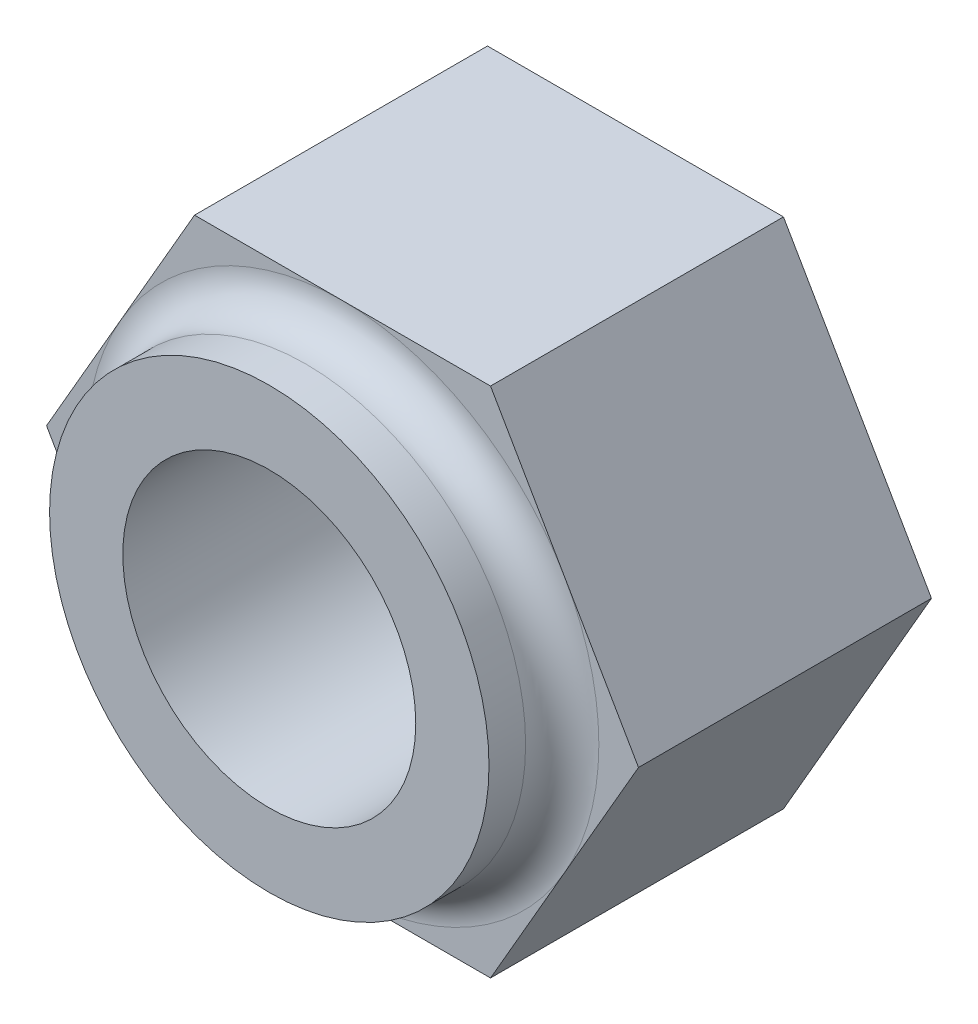
ISO-10303-21;
HEADER;
FILE_DESCRIPTION(('STEP AP214'),'2;1');
FILE_NAME('part.step','',(''),(''),'','','');
FILE_SCHEMA(('AUTOMOTIVE_DESIGN { 1 0 10303 214 1 1 1 1 }'));
ENDSEC;
DATA;
#1=APPLICATION_CONTEXT('core data for automotive mechanical design processes');
#2=APPLICATION_PROTOCOL_DEFINITION('international standard','automotive_design',2000,#1);
#3=PRODUCT_CONTEXT('',#1,'mechanical');
#4=PRODUCT('Part','Part','',(#3));
#5=PRODUCT_RELATED_PRODUCT_CATEGORY('part','',(#4));
#6=PRODUCT_DEFINITION_FORMATION('','',#4);
#7=PRODUCT_DEFINITION_CONTEXT('part definition',#1,'design');
#8=PRODUCT_DEFINITION('design','',#6,#7);
#9=PRODUCT_DEFINITION_SHAPE('','',#8);
#10=(LENGTH_UNIT() NAMED_UNIT(*) SI_UNIT(.MILLI.,.METRE.));
#11=(NAMED_UNIT(*) PLANE_ANGLE_UNIT() SI_UNIT($,.RADIAN.));
#12=(NAMED_UNIT(*) SI_UNIT($,.STERADIAN.) SOLID_ANGLE_UNIT());
#13=UNCERTAINTY_MEASURE_WITH_UNIT(LENGTH_MEASURE(1.E-05),#10,'distance_accuracy_value','');
#14=(GEOMETRIC_REPRESENTATION_CONTEXT(3) GLOBAL_UNCERTAINTY_ASSIGNED_CONTEXT((#13)) GLOBAL_UNIT_ASSIGNED_CONTEXT((#10,
#11,#12)) REPRESENTATION_CONTEXT('',''));
#15=CARTESIAN_POINT('',(0.,0.,0.));
#16=DIRECTION('',(0.,0.,1.));
#17=DIRECTION('',(1.,0.,0.));
#18=AXIS2_PLACEMENT_3D('',#15,#16,#17);
#19=CARTESIAN_POINT('',(0.,0.,4.));
#20=DIRECTION('',(0.,0.,1.));
#21=DIRECTION('',(1.,0.,0.));
#22=AXIS2_PLACEMENT_3D('',#19,#20,#21);
#23=PLANE('',#22);
#24=DIRECTION('',(0.499999999999995,0.866025403784441,0.));
#25=VECTOR('',#24,1.);
#26=CARTESIAN_POINT('',(2.02072594216373,-3.49999999999998,4.));
#27=LINE('',#26,#25);
#28=CARTESIAN_POINT('',(2.02072594216373,-3.49999999999998,4.));
#29=VERTEX_POINT('',#28);
#30=CARTESIAN_POINT('',(3.03108891324556,-1.74999999999999,4.));
#31=VERTEX_POINT('',#30);
#32=EDGE_CURVE('E122',#29,#31,#27,.T.);
#33=ORIENTED_EDGE('',*,*,#32,.T.);
#34=CARTESIAN_POINT('',(0.,0.,4.));
#35=DIRECTION('',(0.,0.,1.));
#36=DIRECTION('',(1.,0.,0.));
#37=AXIS2_PLACEMENT_3D('',#34,#35,#36);
#38=CIRCLE('',#37,3.5);
#39=CARTESIAN_POINT('',(0.,-3.5,4.));
#40=VERTEX_POINT('',#39);
#41=EDGE_CURVE('E11',#31,#40,#38,.F.);
#42=ORIENTED_EDGE('',*,*,#41,.T.);
#43=DIRECTION('',(1.,0.,0.));
#44=VECTOR('',#43,1.);
#45=CARTESIAN_POINT('',(-2.02072594216366,-3.50000000000002,4.));
#46=LINE('',#45,#44);
#47=EDGE_CURVE('E187',#40,#29,#46,.T.);
#48=ORIENTED_EDGE('',*,*,#47,.T.);
#49=EDGE_LOOP('',(#33,#42,#48));
#50=FACE_BOUND('',#49,.T.);
#51=ADVANCED_FACE('F43',(#50),#23,.T.);
#52=CARTESIAN_POINT('',(-2.02072594216366,-3.50000000000002,4.));
#53=VERTEX_POINT('',#52);
#54=EDGE_CURVE('E188',#53,#40,#46,.T.);
#55=ORIENTED_EDGE('',*,*,#54,.T.);
#56=CARTESIAN_POINT('',(0.,0.,4.));
#57=DIRECTION('',(0.,0.,1.));
#58=DIRECTION('',(1.,0.,0.));
#59=AXIS2_PLACEMENT_3D('',#56,#57,#58);
#60=CIRCLE('',#59,3.5);
#61=CARTESIAN_POINT('',(-3.03108891324552,-1.75000000000002,4.));
#62=VERTEX_POINT('',#61);
#63=EDGE_CURVE('E51',#40,#62,#60,.F.);
#64=ORIENTED_EDGE('',*,*,#63,.T.);
#65=DIRECTION('',(0.500000000000007,-0.866025403784434,0.));
#66=VECTOR('',#65,1.);
#67=CARTESIAN_POINT('',(-4.04145188432738,0.,4.));
#68=LINE('',#67,#66);
#69=EDGE_CURVE('E176',#62,#53,#68,.T.);
#70=ORIENTED_EDGE('',*,*,#69,.T.);
#71=EDGE_LOOP('',(#55,#64,#70));
#72=FACE_BOUND('',#71,.T.);
#73=ADVANCED_FACE('F226',(#72),#23,.T.);
#74=CARTESIAN_POINT('',(-4.04145188432738,0.,4.));
#75=VERTEX_POINT('',#74);
#76=EDGE_CURVE('E160',#75,#62,#68,.T.);
#77=ORIENTED_EDGE('',*,*,#76,.T.);
#78=CARTESIAN_POINT('',(0.,0.,4.));
#79=DIRECTION('',(0.,0.,1.));
#80=DIRECTION('',(1.,0.,0.));
#81=AXIS2_PLACEMENT_3D('',#78,#79,#80);
#82=CIRCLE('',#81,3.5);
#83=CARTESIAN_POINT('',(-3.03108891324554,1.74999999999998,4.));
#84=VERTEX_POINT('',#83);
#85=EDGE_CURVE('E153',#62,#84,#82,.F.);
#86=ORIENTED_EDGE('',*,*,#85,.T.);
#87=DIRECTION('',(-0.499999999999995,-0.866025403784441,0.));
#88=VECTOR('',#87,1.);
#89=CARTESIAN_POINT('',(-2.02072594216371,3.49999999999999,4.));
#90=LINE('',#89,#88);
#91=EDGE_CURVE('E158',#84,#75,#90,.T.);
#92=ORIENTED_EDGE('',*,*,#91,.T.);
#93=EDGE_LOOP('',(#77,#86,#92));
#94=FACE_BOUND('',#93,.T.);
#95=ADVANCED_FACE('F157',(#94),#23,.T.);
#96=CARTESIAN_POINT('',(-2.02072594216371,3.49999999999999,4.));
#97=VERTEX_POINT('',#96);
#98=EDGE_CURVE('E167',#97,#84,#90,.T.);
#99=ORIENTED_EDGE('',*,*,#98,.T.);
#100=CARTESIAN_POINT('',(0.,0.,4.));
#101=DIRECTION('',(0.,0.,1.));
#102=DIRECTION('',(1.,0.,0.));
#103=AXIS2_PLACEMENT_3D('',#100,#101,#102);
#104=CIRCLE('',#103,3.5);
#105=CARTESIAN_POINT('',(0.,3.5,4.));
#106=VERTEX_POINT('',#105);
#107=EDGE_CURVE('E151',#84,#106,#104,.F.);
#108=ORIENTED_EDGE('',*,*,#107,.T.);
#109=DIRECTION('',(-1.,0.,0.));
#110=VECTOR('',#109,1.);
#111=CARTESIAN_POINT('',(2.02072594216368,3.50000000000001,4.));
#112=LINE('',#111,#110);
#113=EDGE_CURVE('E133',#106,#97,#112,.T.);
#114=ORIENTED_EDGE('',*,*,#113,.T.);
#115=EDGE_LOOP('',(#99,#108,#114));
#116=FACE_BOUND('',#115,.T.);
#117=ADVANCED_FACE('F174',(#116),#23,.T.);
#118=CARTESIAN_POINT('',(2.02072594216368,3.50000000000001,4.));
#119=VERTEX_POINT('',#118);
#120=EDGE_CURVE('E171',#119,#106,#112,.T.);
#121=ORIENTED_EDGE('',*,*,#120,.T.);
#122=CARTESIAN_POINT('',(0.,0.,4.));
#123=DIRECTION('',(0.,0.,1.));
#124=DIRECTION('',(1.,0.,0.));
#125=AXIS2_PLACEMENT_3D('',#122,#123,#124);
#126=CIRCLE('',#125,3.5);
#127=CARTESIAN_POINT('',(3.03108891324553,1.75,4.));
#128=VERTEX_POINT('',#127);
#129=EDGE_CURVE('E149',#106,#128,#126,.F.);
#130=ORIENTED_EDGE('',*,*,#129,.T.);
#131=DIRECTION('',(-0.500000000000001,0.866025403784438,0.));
#132=VECTOR('',#131,1.);
#133=CARTESIAN_POINT('',(4.04145188432738,0.,4.));
#134=LINE('',#133,#132);
#135=EDGE_CURVE('E132',#128,#119,#134,.T.);
#136=ORIENTED_EDGE('',*,*,#135,.T.);
#137=EDGE_LOOP('',(#121,#130,#136));
#138=FACE_BOUND('',#137,.T.);
#139=ADVANCED_FACE('F181',(#138),#23,.T.);
#140=CARTESIAN_POINT('',(0.,0.,5.));
#141=DIRECTION('',(0.,0.,1.));
#142=DIRECTION('',(1.,0.,0.));
#143=AXIS2_PLACEMENT_3D('',#140,#141,#142);
#144=PLANE('',#143);
#145=CARTESIAN_POINT('',(0.,0.,5.));
#146=DIRECTION('',(0.,0.,1.));
#147=DIRECTION('',(1.,0.,0.));
#148=AXIS2_PLACEMENT_3D('',#145,#146,#147);
#149=CIRCLE('',#148,2.);
#150=CARTESIAN_POINT('',(2.,0.,5.));
#151=VERTEX_POINT('',#150);
#152=EDGE_CURVE('E191',#151,#151,#149,.T.);
#153=ORIENTED_EDGE('',*,*,#152,.F.);
#154=EDGE_LOOP('',(#153));
#155=FACE_BOUND('',#154,.T.);
#156=CARTESIAN_POINT('',(0.,0.,5.));
#157=DIRECTION('',(0.,0.,1.));
#158=DIRECTION('',(1.,0.,0.));
#159=AXIS2_PLACEMENT_3D('',#156,#157,#158);
#160=CIRCLE('',#159,3.);
#161=CARTESIAN_POINT('',(3.,0.,5.));
#162=VERTEX_POINT('',#161);
#163=EDGE_CURVE('E123',#162,#162,#160,.T.);
#164=ORIENTED_EDGE('',*,*,#163,.T.);
#165=EDGE_LOOP('',(#164));
#166=FACE_BOUND('',#165,.T.);
#167=ADVANCED_FACE('F236',(#155,#166),#144,.T.);
#168=CARTESIAN_POINT('',(2.02072594216373,-3.49999999999998,5.));
#169=DIRECTION('',(-0.866025403784441,0.499999999999995,0.));
#170=DIRECTION('',(-0.499999999999995,-0.866025403784441,0.));
#171=AXIS2_PLACEMENT_3D('',#168,#169,#170);
#172=PLANE('',#171);
#173=ORIENTED_EDGE('',*,*,#32,.F.);
#174=DIRECTION('',(0.,0.,-1.));
#175=VECTOR('',#174,1.);
#176=CARTESIAN_POINT('',(2.02072594216373,-3.49999999999998,5.));
#177=LINE('',#176,#175);
#178=CARTESIAN_POINT('',(2.02072594216373,-3.49999999999998,0.));
#179=VERTEX_POINT('',#178);
#180=EDGE_CURVE('E210',#29,#179,#177,.T.);
#181=ORIENTED_EDGE('',*,*,#180,.T.);
#182=DIRECTION('',(0.499999999999995,0.866025403784441,0.));
#183=VECTOR('',#182,1.);
#184=CARTESIAN_POINT('',(2.02072594216373,-3.49999999999998,0.));
#185=LINE('',#184,#183);
#186=CARTESIAN_POINT('',(4.04145188432738,0.,0.));
#187=VERTEX_POINT('',#186);
#188=EDGE_CURVE('E138',#179,#187,#185,.T.);
#189=ORIENTED_EDGE('',*,*,#188,.T.);
#190=DIRECTION('',(0.,0.,-1.));
#191=VECTOR('',#190,1.);
#192=CARTESIAN_POINT('',(4.04145188432738,0.,5.));
#193=LINE('',#192,#191);
#194=CARTESIAN_POINT('',(4.04145188432738,0.,4.));
#195=VERTEX_POINT('',#194);
#196=EDGE_CURVE('E129',#195,#187,#193,.T.);
#197=ORIENTED_EDGE('',*,*,#196,.F.);
#198=EDGE_CURVE('E112',#31,#195,#27,.T.);
#199=ORIENTED_EDGE('',*,*,#198,.F.);
#200=EDGE_LOOP('',(#173,#181,#189,#197,#199));
#201=FACE_BOUND('',#200,.T.);
#202=ADVANCED_FACE('F136',(#201),#172,.F.);
#203=CARTESIAN_POINT('',(4.04145188432738,0.,5.));
#204=DIRECTION('',(-0.866025403784438,-0.500000000000001,0.));
#205=DIRECTION('',(0.500000000000001,-0.866025403784438,0.));
#206=AXIS2_PLACEMENT_3D('',#203,#204,#205);
#207=PLANE('',#206);
#208=EDGE_CURVE('E115',#195,#128,#134,.T.);
#209=ORIENTED_EDGE('',*,*,#208,.F.);
#210=ORIENTED_EDGE('',*,*,#196,.T.);
#211=DIRECTION('',(-0.500000000000001,0.866025403784438,0.));
#212=VECTOR('',#211,1.);
#213=CARTESIAN_POINT('',(4.04145188432738,0.,0.));
#214=LINE('',#213,#212);
#215=CARTESIAN_POINT('',(2.02072594216368,3.50000000000001,0.));
#216=VERTEX_POINT('',#215);
#217=EDGE_CURVE('E197',#187,#216,#214,.T.);
#218=ORIENTED_EDGE('',*,*,#217,.T.);
#219=DIRECTION('',(0.,0.,-1.));
#220=VECTOR('',#219,1.);
#221=CARTESIAN_POINT('',(2.02072594216368,3.50000000000001,5.));
#222=LINE('',#221,#220);
#223=EDGE_CURVE('E140',#119,#216,#222,.T.);
#224=ORIENTED_EDGE('',*,*,#223,.F.);
#225=ORIENTED_EDGE('',*,*,#135,.F.);
#226=EDGE_LOOP('',(#209,#210,#218,#224,#225));
#227=FACE_BOUND('',#226,.T.);
#228=ADVANCED_FACE('F127',(#227),#207,.F.);
#229=CARTESIAN_POINT('',(2.02072594216368,3.50000000000001,5.));
#230=DIRECTION('',(0.,-1.,0.));
#231=DIRECTION('',(1.,0.,0.));
#232=AXIS2_PLACEMENT_3D('',#229,#230,#231);
#233=PLANE('',#232);
#234=ORIENTED_EDGE('',*,*,#120,.F.);
#235=ORIENTED_EDGE('',*,*,#223,.T.);
#236=DIRECTION('',(-1.,0.,0.));
#237=VECTOR('',#236,1.);
#238=CARTESIAN_POINT('',(2.02072594216368,3.50000000000001,0.));
#239=LINE('',#238,#237);
#240=CARTESIAN_POINT('',(-2.02072594216371,3.49999999999999,0.));
#241=VERTEX_POINT('',#240);
#242=EDGE_CURVE('E199',#216,#241,#239,.T.);
#243=ORIENTED_EDGE('',*,*,#242,.T.);
#244=DIRECTION('',(0.,0.,-1.));
#245=VECTOR('',#244,1.);
#246=CARTESIAN_POINT('',(-2.02072594216371,3.49999999999999,5.));
#247=LINE('',#246,#245);
#248=EDGE_CURVE('E144',#97,#241,#247,.T.);
#249=ORIENTED_EDGE('',*,*,#248,.F.);
#250=ORIENTED_EDGE('',*,*,#113,.F.);
#251=EDGE_LOOP('',(#234,#235,#243,#249,#250));
#252=FACE_BOUND('',#251,.T.);
#253=ADVANCED_FACE('F217',(#252),#233,.F.);
#254=CARTESIAN_POINT('',(-2.02072594216371,3.49999999999999,5.));
#255=DIRECTION('',(0.866025403784442,-0.499999999999995,0.));
#256=DIRECTION('',(0.499999999999995,0.866025403784442,0.));
#257=AXIS2_PLACEMENT_3D('',#254,#255,#256);
#258=PLANE('',#257);
#259=ORIENTED_EDGE('',*,*,#98,.F.);
#260=ORIENTED_EDGE('',*,*,#248,.T.);
#261=DIRECTION('',(-0.499999999999995,-0.866025403784441,0.));
#262=VECTOR('',#261,1.);
#263=CARTESIAN_POINT('',(-2.02072594216371,3.49999999999999,0.));
#264=LINE('',#263,#262);
#265=CARTESIAN_POINT('',(-4.04145188432738,0.,0.));
#266=VERTEX_POINT('',#265);
#267=EDGE_CURVE('E202',#241,#266,#264,.T.);
#268=ORIENTED_EDGE('',*,*,#267,.T.);
#269=DIRECTION('',(0.,0.,-1.));
#270=VECTOR('',#269,1.);
#271=CARTESIAN_POINT('',(-4.04145188432738,0.,5.));
#272=LINE('',#271,#270);
#273=EDGE_CURVE('E170',#75,#266,#272,.T.);
#274=ORIENTED_EDGE('',*,*,#273,.F.);
#275=ORIENTED_EDGE('',*,*,#91,.F.);
#276=EDGE_LOOP('',(#259,#260,#268,#274,#275));
#277=FACE_BOUND('',#276,.T.);
#278=ADVANCED_FACE('F166',(#277),#258,.F.);
#279=CARTESIAN_POINT('',(-4.04145188432738,0.,5.));
#280=DIRECTION('',(0.866025403784435,0.500000000000007,0.));
#281=DIRECTION('',(-0.500000000000007,0.866025403784435,0.));
#282=AXIS2_PLACEMENT_3D('',#279,#280,#281);
#283=PLANE('',#282);
#284=ORIENTED_EDGE('',*,*,#76,.F.);
#285=ORIENTED_EDGE('',*,*,#273,.T.);
#286=DIRECTION('',(0.500000000000007,-0.866025403784434,0.));
#287=VECTOR('',#286,1.);
#288=CARTESIAN_POINT('',(-4.04145188432738,0.,0.));
#289=LINE('',#288,#287);
#290=CARTESIAN_POINT('',(-2.02072594216366,-3.50000000000002,0.));
#291=VERTEX_POINT('',#290);
#292=EDGE_CURVE('E204',#266,#291,#289,.T.);
#293=ORIENTED_EDGE('',*,*,#292,.T.);
#294=DIRECTION('',(0.,0.,-1.));
#295=VECTOR('',#294,1.);
#296=CARTESIAN_POINT('',(-2.02072594216366,-3.50000000000002,5.));
#297=LINE('',#296,#295);
#298=EDGE_CURVE('E212',#53,#291,#297,.T.);
#299=ORIENTED_EDGE('',*,*,#298,.F.);
#300=ORIENTED_EDGE('',*,*,#69,.F.);
#301=EDGE_LOOP('',(#284,#285,#293,#299,#300));
#302=FACE_BOUND('',#301,.T.);
#303=ADVANCED_FACE('F224',(#302),#283,.F.);
#304=CARTESIAN_POINT('',(-2.02072594216366,-3.50000000000002,5.));
#305=DIRECTION('',(0.,1.,0.));
#306=DIRECTION('',(-1.,0.,0.));
#307=AXIS2_PLACEMENT_3D('',#304,#305,#306);
#308=PLANE('',#307);
#309=ORIENTED_EDGE('',*,*,#54,.F.);
#310=ORIENTED_EDGE('',*,*,#298,.T.);
#311=DIRECTION('',(1.,0.,0.));
#312=VECTOR('',#311,1.);
#313=CARTESIAN_POINT('',(-2.02072594216366,-3.50000000000002,0.));
#314=LINE('',#313,#312);
#315=EDGE_CURVE('E207',#291,#179,#314,.T.);
#316=ORIENTED_EDGE('',*,*,#315,.T.);
#317=ORIENTED_EDGE('',*,*,#180,.F.);
#318=ORIENTED_EDGE('',*,*,#47,.F.);
#319=EDGE_LOOP('',(#309,#310,#316,#317,#318));
#320=FACE_BOUND('',#319,.T.);
#321=ADVANCED_FACE('F229',(#320),#308,.F.);
#322=CARTESIAN_POINT('',(0.,0.,0.));
#323=DIRECTION('',(0.,0.,1.));
#324=DIRECTION('',(1.,0.,0.));
#325=AXIS2_PLACEMENT_3D('',#322,#323,#324);
#326=PLANE('',#325);
#327=ORIENTED_EDGE('',*,*,#188,.F.);
#328=ORIENTED_EDGE('',*,*,#315,.F.);
#329=ORIENTED_EDGE('',*,*,#292,.F.);
#330=ORIENTED_EDGE('',*,*,#267,.F.);
#331=ORIENTED_EDGE('',*,*,#242,.F.);
#332=ORIENTED_EDGE('',*,*,#217,.F.);
#333=EDGE_LOOP('',(#327,#328,#329,#330,#331,#332));
#334=FACE_BOUND('',#333,.T.);
#335=CARTESIAN_POINT('',(0.,0.,0.));
#336=DIRECTION('',(0.,0.,1.));
#337=DIRECTION('',(1.,0.,0.));
#338=AXIS2_PLACEMENT_3D('',#335,#336,#337);
#339=CIRCLE('',#338,2.);
#340=CARTESIAN_POINT('',(2.,0.,0.));
#341=VERTEX_POINT('',#340);
#342=EDGE_CURVE('E190',#341,#341,#339,.T.);
#343=ORIENTED_EDGE('',*,*,#342,.T.);
#344=EDGE_LOOP('',(#343));
#345=FACE_BOUND('',#344,.T.);
#346=ADVANCED_FACE('F219',(#334,#345),#326,.F.);
#347=CARTESIAN_POINT('',(0.,0.,5.));
#348=DIRECTION('',(0.,0.,-1.));
#349=DIRECTION('',(-1.,0.,0.));
#350=AXIS2_PLACEMENT_3D('',#347,#348,#349);
#351=CYLINDRICAL_SURFACE('',#350,2.);
#352=ORIENTED_EDGE('',*,*,#152,.T.);
#353=EDGE_LOOP('',(#352));
#354=FACE_BOUND('',#353,.T.);
#355=ORIENTED_EDGE('',*,*,#342,.F.);
#356=EDGE_LOOP('',(#355));
#357=FACE_BOUND('',#356,.T.);
#358=ADVANCED_FACE('F246',(#354,#357),#351,.F.);
#359=ORIENTED_EDGE('',*,*,#208,.T.);
#360=CARTESIAN_POINT('',(0.,0.,4.));
#361=DIRECTION('',(0.,0.,1.));
#362=DIRECTION('',(1.,0.,0.));
#363=AXIS2_PLACEMENT_3D('',#360,#361,#362);
#364=CIRCLE('',#363,3.5);
#365=EDGE_CURVE('E117',#128,#31,#364,.F.);
#366=ORIENTED_EDGE('',*,*,#365,.T.);
#367=ORIENTED_EDGE('',*,*,#198,.T.);
#368=EDGE_LOOP('',(#359,#366,#367));
#369=FACE_BOUND('',#368,.T.);
#370=ADVANCED_FACE('F114',(#369),#23,.T.);
#371=CARTESIAN_POINT('',(0.,0.,4.));
#372=DIRECTION('',(0.,0.,1.));
#373=DIRECTION('',(1.,0.,0.));
#374=AXIS2_PLACEMENT_3D('',#371,#372,#373);
#375=CYLINDRICAL_SURFACE('',#374,3.);
#376=CARTESIAN_POINT('',(0.,0.,4.5));
#377=DIRECTION('',(0.,0.,1.));
#378=DIRECTION('',(1.,0.,0.));
#379=AXIS2_PLACEMENT_3D('',#376,#377,#378);
#380=CIRCLE('',#379,3.);
#381=CARTESIAN_POINT('',(3.,0.,4.5));
#382=VERTEX_POINT('',#381);
#383=EDGE_CURVE('E139',#382,#382,#380,.T.);
#384=ORIENTED_EDGE('',*,*,#383,.T.);
#385=EDGE_LOOP('',(#384));
#386=FACE_BOUND('',#385,.T.);
#387=ORIENTED_EDGE('',*,*,#163,.F.);
#388=EDGE_LOOP('',(#387));
#389=FACE_BOUND('',#388,.T.);
#390=ADVANCED_FACE('F238',(#386,#389),#375,.T.);
#391=CARTESIAN_POINT('',(0.,0.,4.5));
#392=DIRECTION('',(0.,0.,1.));
#393=DIRECTION('',(1.,0.,0.));
#394=AXIS2_PLACEMENT_3D('',#391,#392,#393);
#395=TOROIDAL_SURFACE('',#394,3.5,0.5);
#396=ORIENTED_EDGE('',*,*,#63,.F.);
#397=ORIENTED_EDGE('',*,*,#41,.F.);
#398=ORIENTED_EDGE('',*,*,#365,.F.);
#399=ORIENTED_EDGE('',*,*,#129,.F.);
#400=ORIENTED_EDGE('',*,*,#107,.F.);
#401=ORIENTED_EDGE('',*,*,#85,.F.);
#402=EDGE_LOOP('',(#396,#397,#398,#399,#400,#401));
#403=FACE_BOUND('',#402,.T.);
#404=ORIENTED_EDGE('',*,*,#383,.F.);
#405=EDGE_LOOP('',(#404));
#406=FACE_BOUND('',#405,.T.);
#407=ADVANCED_FACE('F45',(#403,#406),#395,.F.);
#408=CLOSED_SHELL('',(#51,#73,#95,#117,#139,#167,#202,#228,#253,#278,#303,#321,#346,#358,#370,
#390,#407));
#409=MANIFOLD_SOLID_BREP('B2',#408);
#410=ADVANCED_BREP_SHAPE_REPRESENTATION('',(#18,#409),#14);
#411=SHAPE_DEFINITION_REPRESENTATION(#9,#410);
ENDSEC;
END-ISO-10303-21;
